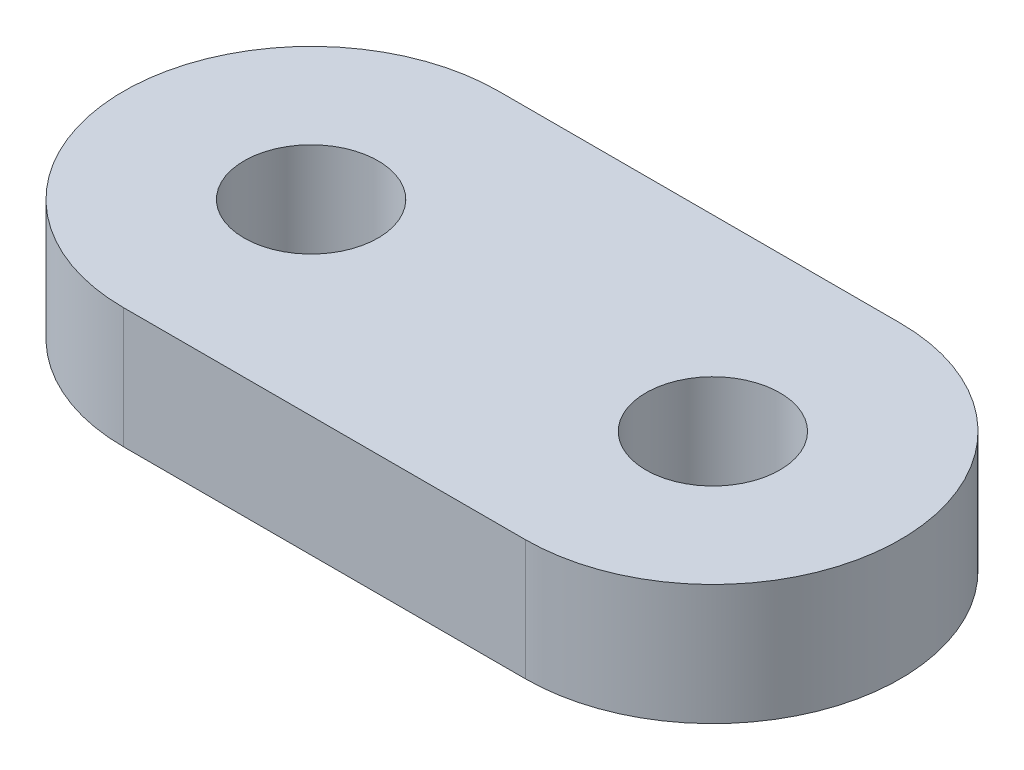
ISO-10303-21;
HEADER;
FILE_DESCRIPTION(('STEP AP214'),'2;1');
FILE_NAME('part.step','',(''),(''),'','','');
FILE_SCHEMA(('AUTOMOTIVE_DESIGN { 1 0 10303 214 1 1 1 1 }'));
ENDSEC;
DATA;
#1=APPLICATION_CONTEXT('core data for automotive mechanical design processes');
#2=APPLICATION_PROTOCOL_DEFINITION('international standard','automotive_design',2000,#1);
#3=PRODUCT_CONTEXT('',#1,'mechanical');
#4=PRODUCT('Part','Part','',(#3));
#5=PRODUCT_RELATED_PRODUCT_CATEGORY('part','',(#4));
#6=PRODUCT_DEFINITION_FORMATION('','',#4);
#7=PRODUCT_DEFINITION_CONTEXT('part definition',#1,'design');
#8=PRODUCT_DEFINITION('design','',#6,#7);
#9=PRODUCT_DEFINITION_SHAPE('','',#8);
#10=(LENGTH_UNIT() NAMED_UNIT(*) SI_UNIT(.MILLI.,.METRE.));
#11=(NAMED_UNIT(*) PLANE_ANGLE_UNIT() SI_UNIT($,.RADIAN.));
#12=(NAMED_UNIT(*) SI_UNIT($,.STERADIAN.) SOLID_ANGLE_UNIT());
#13=UNCERTAINTY_MEASURE_WITH_UNIT(LENGTH_MEASURE(1.E-05),#10,'distance_accuracy_value','');
#14=(GEOMETRIC_REPRESENTATION_CONTEXT(3) GLOBAL_UNCERTAINTY_ASSIGNED_CONTEXT((#13)) GLOBAL_UNIT_ASSIGNED_CONTEXT((#10,
#11,#12)) REPRESENTATION_CONTEXT('',''));
#15=CARTESIAN_POINT('',(0.,0.,0.));
#16=DIRECTION('',(0.,0.,1.));
#17=DIRECTION('',(1.,0.,0.));
#18=AXIS2_PLACEMENT_3D('',#15,#16,#17);
#19=CARTESIAN_POINT('',(15.,4.5,0.));
#20=DIRECTION('',(0.,1.,0.));
#21=DIRECTION('',(0.,0.,1.));
#22=AXIS2_PLACEMENT_3D('',#19,#20,#21);
#23=PLANE('',#22);
#24=CARTESIAN_POINT('',(15.,4.5,0.));
#25=DIRECTION('',(0.,1.,0.));
#26=DIRECTION('',(0.,0.,1.));
#27=AXIS2_PLACEMENT_3D('',#24,#25,#26);
#28=CIRCLE('',#27,2.5);
#29=CARTESIAN_POINT('',(15.,4.5,2.5));
#30=VERTEX_POINT('',#29);
#31=EDGE_CURVE('E99',#30,#30,#28,.T.);
#32=ORIENTED_EDGE('',*,*,#31,.F.);
#33=EDGE_LOOP('',(#32));
#34=FACE_BOUND('',#33,.T.);
#35=CARTESIAN_POINT('',(15.,4.5,0.));
#36=DIRECTION('',(0.,1.,0.));
#37=DIRECTION('',(0.,0.,1.));
#38=AXIS2_PLACEMENT_3D('',#35,#36,#37);
#39=CIRCLE('',#38,7.);
#40=CARTESIAN_POINT('',(15.,4.5,-7.));
#41=VERTEX_POINT('',#40);
#42=CARTESIAN_POINT('',(15.,4.5,7.));
#43=VERTEX_POINT('',#42);
#44=EDGE_CURVE('E84',#41,#43,#39,.T.);
#45=ORIENTED_EDGE('',*,*,#44,.T.);
#46=DIRECTION('',(1.,0.,0.));
#47=VECTOR('',#46,1.);
#48=CARTESIAN_POINT('',(15.,4.5,7.));
#49=LINE('',#48,#47);
#50=CARTESIAN_POINT('',(30.,4.5,7.));
#51=VERTEX_POINT('',#50);
#52=EDGE_CURVE('E79',#43,#51,#49,.T.);
#53=ORIENTED_EDGE('',*,*,#52,.T.);
#54=CARTESIAN_POINT('',(30.,4.5,0.));
#55=DIRECTION('',(0.,1.,0.));
#56=DIRECTION('',(0.,0.,1.));
#57=AXIS2_PLACEMENT_3D('',#54,#55,#56);
#58=CIRCLE('',#57,7.);
#59=CARTESIAN_POINT('',(30.,4.5,-7.));
#60=VERTEX_POINT('',#59);
#61=EDGE_CURVE('E82',#51,#60,#58,.T.);
#62=ORIENTED_EDGE('',*,*,#61,.T.);
#63=DIRECTION('',(-1.,0.,0.));
#64=VECTOR('',#63,1.);
#65=CARTESIAN_POINT('',(15.,4.5,-7.));
#66=LINE('',#65,#64);
#67=EDGE_CURVE('E49',#60,#41,#66,.T.);
#68=ORIENTED_EDGE('',*,*,#67,.T.);
#69=EDGE_LOOP('',(#45,#53,#62,#68));
#70=FACE_BOUND('',#69,.T.);
#71=CARTESIAN_POINT('',(30.,4.5,0.));
#72=DIRECTION('',(0.,1.,0.));
#73=DIRECTION('',(0.,0.,1.));
#74=AXIS2_PLACEMENT_3D('',#71,#72,#73);
#75=CIRCLE('',#74,2.5);
#76=CARTESIAN_POINT('',(30.,4.5,2.5));
#77=VERTEX_POINT('',#76);
#78=EDGE_CURVE('E114',#77,#77,#75,.T.);
#79=ORIENTED_EDGE('',*,*,#78,.F.);
#80=EDGE_LOOP('',(#79));
#81=FACE_BOUND('',#80,.T.);
#82=ADVANCED_FACE('F32',(#34,#70,#81),#23,.T.);
#83=CARTESIAN_POINT('',(15.,0.,0.));
#84=DIRECTION('',(0.,1.,0.));
#85=DIRECTION('',(0.,0.,1.));
#86=AXIS2_PLACEMENT_3D('',#83,#84,#85);
#87=PLANE('',#86);
#88=CARTESIAN_POINT('',(15.,0.,0.));
#89=DIRECTION('',(0.,1.,0.));
#90=DIRECTION('',(0.,0.,1.));
#91=AXIS2_PLACEMENT_3D('',#88,#89,#90);
#92=CIRCLE('',#91,2.5);
#93=CARTESIAN_POINT('',(15.,0.,2.5));
#94=VERTEX_POINT('',#93);
#95=EDGE_CURVE('E111',#94,#94,#92,.T.);
#96=ORIENTED_EDGE('',*,*,#95,.T.);
#97=EDGE_LOOP('',(#96));
#98=FACE_BOUND('',#97,.T.);
#99=CARTESIAN_POINT('',(15.,0.,0.));
#100=DIRECTION('',(0.,1.,0.));
#101=DIRECTION('',(0.,0.,1.));
#102=AXIS2_PLACEMENT_3D('',#99,#100,#101);
#103=CIRCLE('',#102,7.);
#104=CARTESIAN_POINT('',(15.,0.,-7.));
#105=VERTEX_POINT('',#104);
#106=CARTESIAN_POINT('',(15.,0.,7.));
#107=VERTEX_POINT('',#106);
#108=EDGE_CURVE('E96',#105,#107,#103,.T.);
#109=ORIENTED_EDGE('',*,*,#108,.F.);
#110=DIRECTION('',(-1.,0.,0.));
#111=VECTOR('',#110,1.);
#112=CARTESIAN_POINT('',(15.,0.,-7.));
#113=LINE('',#112,#111);
#114=CARTESIAN_POINT('',(30.,0.,-7.));
#115=VERTEX_POINT('',#114);
#116=EDGE_CURVE('E72',#115,#105,#113,.T.);
#117=ORIENTED_EDGE('',*,*,#116,.F.);
#118=CARTESIAN_POINT('',(30.,0.,0.));
#119=DIRECTION('',(0.,1.,0.));
#120=DIRECTION('',(0.,0.,1.));
#121=AXIS2_PLACEMENT_3D('',#118,#119,#120);
#122=CIRCLE('',#121,7.);
#123=CARTESIAN_POINT('',(30.,0.,7.));
#124=VERTEX_POINT('',#123);
#125=EDGE_CURVE('E66',#124,#115,#122,.T.);
#126=ORIENTED_EDGE('',*,*,#125,.F.);
#127=DIRECTION('',(1.,0.,0.));
#128=VECTOR('',#127,1.);
#129=CARTESIAN_POINT('',(15.,0.,7.));
#130=LINE('',#129,#128);
#131=EDGE_CURVE('E88',#107,#124,#130,.T.);
#132=ORIENTED_EDGE('',*,*,#131,.F.);
#133=EDGE_LOOP('',(#109,#117,#126,#132));
#134=FACE_BOUND('',#133,.T.);
#135=CARTESIAN_POINT('',(30.,0.,0.));
#136=DIRECTION('',(0.,1.,0.));
#137=DIRECTION('',(0.,0.,1.));
#138=AXIS2_PLACEMENT_3D('',#135,#136,#137);
#139=CIRCLE('',#138,2.5);
#140=CARTESIAN_POINT('',(30.,0.,2.5));
#141=VERTEX_POINT('',#140);
#142=EDGE_CURVE('E117',#141,#141,#139,.T.);
#143=ORIENTED_EDGE('',*,*,#142,.T.);
#144=EDGE_LOOP('',(#143));
#145=FACE_BOUND('',#144,.T.);
#146=ADVANCED_FACE('F107',(#98,#134,#145),#87,.F.);
#147=CARTESIAN_POINT('',(15.,4.5,0.));
#148=DIRECTION('',(0.,-1.,0.));
#149=DIRECTION('',(0.,0.,-1.));
#150=AXIS2_PLACEMENT_3D('',#147,#148,#149);
#151=CYLINDRICAL_SURFACE('',#150,7.);
#152=ORIENTED_EDGE('',*,*,#108,.T.);
#153=DIRECTION('',(0.,-1.,0.));
#154=VECTOR('',#153,1.);
#155=CARTESIAN_POINT('',(15.,4.5,7.));
#156=LINE('',#155,#154);
#157=EDGE_CURVE('E11',#43,#107,#156,.T.);
#158=ORIENTED_EDGE('',*,*,#157,.F.);
#159=ORIENTED_EDGE('',*,*,#44,.F.);
#160=DIRECTION('',(0.,-1.,0.));
#161=VECTOR('',#160,1.);
#162=CARTESIAN_POINT('',(15.,4.5,-7.));
#163=LINE('',#162,#161);
#164=EDGE_CURVE('E92',#41,#105,#163,.T.);
#165=ORIENTED_EDGE('',*,*,#164,.T.);
#166=EDGE_LOOP('',(#152,#158,#159,#165));
#167=FACE_BOUND('',#166,.T.);
#168=ADVANCED_FACE('F34',(#167),#151,.T.);
#169=CARTESIAN_POINT('',(15.,4.5,7.));
#170=DIRECTION('',(0.,0.,-1.));
#171=DIRECTION('',(-1.,0.,0.));
#172=AXIS2_PLACEMENT_3D('',#169,#170,#171);
#173=PLANE('',#172);
#174=ORIENTED_EDGE('',*,*,#131,.T.);
#175=DIRECTION('',(0.,-1.,0.));
#176=VECTOR('',#175,1.);
#177=CARTESIAN_POINT('',(30.,4.5,7.));
#178=LINE('',#177,#176);
#179=EDGE_CURVE('E41',#51,#124,#178,.T.);
#180=ORIENTED_EDGE('',*,*,#179,.F.);
#181=ORIENTED_EDGE('',*,*,#52,.F.);
#182=ORIENTED_EDGE('',*,*,#157,.T.);
#183=EDGE_LOOP('',(#174,#180,#181,#182));
#184=FACE_BOUND('',#183,.T.);
#185=ADVANCED_FACE('F87',(#184),#173,.F.);
#186=CARTESIAN_POINT('',(30.,4.5,0.));
#187=DIRECTION('',(0.,-1.,0.));
#188=DIRECTION('',(0.,0.,-1.));
#189=AXIS2_PLACEMENT_3D('',#186,#187,#188);
#190=CYLINDRICAL_SURFACE('',#189,7.);
#191=ORIENTED_EDGE('',*,*,#125,.T.);
#192=DIRECTION('',(0.,-1.,0.));
#193=VECTOR('',#192,1.);
#194=CARTESIAN_POINT('',(30.,4.5,-7.));
#195=LINE('',#194,#193);
#196=EDGE_CURVE('E89',#60,#115,#195,.T.);
#197=ORIENTED_EDGE('',*,*,#196,.F.);
#198=ORIENTED_EDGE('',*,*,#61,.F.);
#199=ORIENTED_EDGE('',*,*,#179,.T.);
#200=EDGE_LOOP('',(#191,#197,#198,#199));
#201=FACE_BOUND('',#200,.T.);
#202=ADVANCED_FACE('F90',(#201),#190,.T.);
#203=CARTESIAN_POINT('',(15.,4.5,-7.));
#204=DIRECTION('',(0.,0.,1.));
#205=DIRECTION('',(1.,0.,0.));
#206=AXIS2_PLACEMENT_3D('',#203,#204,#205);
#207=PLANE('',#206);
#208=ORIENTED_EDGE('',*,*,#116,.T.);
#209=ORIENTED_EDGE('',*,*,#164,.F.);
#210=ORIENTED_EDGE('',*,*,#67,.F.);
#211=ORIENTED_EDGE('',*,*,#196,.T.);
#212=EDGE_LOOP('',(#208,#209,#210,#211));
#213=FACE_BOUND('',#212,.T.);
#214=ADVANCED_FACE('F104',(#213),#207,.F.);
#215=CARTESIAN_POINT('',(15.,4.5,0.));
#216=DIRECTION('',(0.,-1.,0.));
#217=DIRECTION('',(0.,0.,-1.));
#218=AXIS2_PLACEMENT_3D('',#215,#216,#217);
#219=CYLINDRICAL_SURFACE('',#218,2.5);
#220=ORIENTED_EDGE('',*,*,#31,.T.);
#221=EDGE_LOOP('',(#220));
#222=FACE_BOUND('',#221,.T.);
#223=ORIENTED_EDGE('',*,*,#95,.F.);
#224=EDGE_LOOP('',(#223));
#225=FACE_BOUND('',#224,.T.);
#226=ADVANCED_FACE('F135',(#222,#225),#219,.F.);
#227=CARTESIAN_POINT('',(30.,4.5,0.));
#228=DIRECTION('',(0.,-1.,0.));
#229=DIRECTION('',(0.,0.,-1.));
#230=AXIS2_PLACEMENT_3D('',#227,#228,#229);
#231=CYLINDRICAL_SURFACE('',#230,2.5);
#232=ORIENTED_EDGE('',*,*,#78,.T.);
#233=EDGE_LOOP('',(#232));
#234=FACE_BOUND('',#233,.T.);
#235=ORIENTED_EDGE('',*,*,#142,.F.);
#236=EDGE_LOOP('',(#235));
#237=FACE_BOUND('',#236,.T.);
#238=ADVANCED_FACE('F123',(#234,#237),#231,.F.);
#239=CLOSED_SHELL('',(#82,#146,#168,#185,#202,#214,#226,#238));
#240=MANIFOLD_SOLID_BREP('B2',#239);
#241=ADVANCED_BREP_SHAPE_REPRESENTATION('',(#18,#240),#14);
#242=SHAPE_DEFINITION_REPRESENTATION(#9,#241);
ENDSEC;
END-ISO-10303-21;
